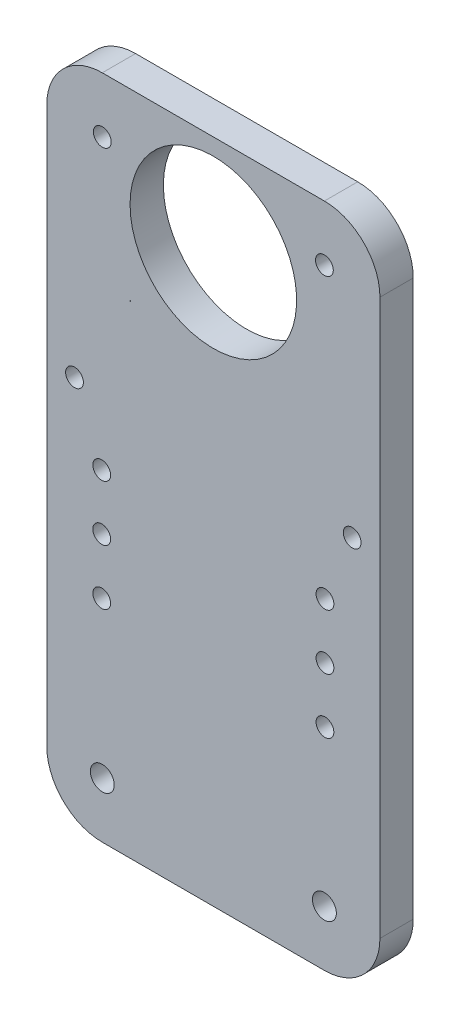
ISO-10303-21;
HEADER;
FILE_DESCRIPTION(('STEP AP214'),'2;1');
FILE_NAME('part.step','',(''),(''),'','','');
FILE_SCHEMA(('AUTOMOTIVE_DESIGN { 1 0 10303 214 1 1 1 1 }'));
ENDSEC;
DATA;
#1=APPLICATION_CONTEXT('core data for automotive mechanical design processes');
#2=APPLICATION_PROTOCOL_DEFINITION('international standard','automotive_design',2000,#1);
#3=PRODUCT_CONTEXT('',#1,'mechanical');
#4=PRODUCT('Part','Part','',(#3));
#5=PRODUCT_RELATED_PRODUCT_CATEGORY('part','',(#4));
#6=PRODUCT_DEFINITION_FORMATION('','',#4);
#7=PRODUCT_DEFINITION_CONTEXT('part definition',#1,'design');
#8=PRODUCT_DEFINITION('design','',#6,#7);
#9=PRODUCT_DEFINITION_SHAPE('','',#8);
#10=(LENGTH_UNIT() NAMED_UNIT(*) SI_UNIT(.MILLI.,.METRE.));
#11=(NAMED_UNIT(*) PLANE_ANGLE_UNIT() SI_UNIT($,.RADIAN.));
#12=(NAMED_UNIT(*) SI_UNIT($,.STERADIAN.) SOLID_ANGLE_UNIT());
#13=UNCERTAINTY_MEASURE_WITH_UNIT(LENGTH_MEASURE(1.E-05),#10,'distance_accuracy_value','');
#14=(GEOMETRIC_REPRESENTATION_CONTEXT(3) GLOBAL_UNCERTAINTY_ASSIGNED_CONTEXT((#13)) GLOBAL_UNIT_ASSIGNED_CONTEXT((#10,
#11,#12)) REPRESENTATION_CONTEXT('',''));
#15=CARTESIAN_POINT('',(0.,0.,0.));
#16=DIRECTION('',(0.,0.,1.));
#17=DIRECTION('',(1.,0.,0.));
#18=AXIS2_PLACEMENT_3D('',#15,#16,#17);
#19=CARTESIAN_POINT('',(0.,0.,6.));
#20=DIRECTION('',(0.,0.,1.));
#21=DIRECTION('',(1.,0.,0.));
#22=AXIS2_PLACEMENT_3D('',#19,#20,#21);
#23=PLANE('',#22);
#24=CARTESIAN_POINT('',(0.,42.,6.));
#25=DIRECTION('',(0.,0.,-1.));
#26=DIRECTION('',(-1.,0.,0.));
#27=AXIS2_PLACEMENT_3D('',#24,#25,#26);
#28=CIRCLE('',#27,15.);
#29=CARTESIAN_POINT('',(-15.,42.,6.));
#30=VERTEX_POINT('',#29);
#31=EDGE_CURVE('E311',#30,#30,#28,.T.);
#32=ORIENTED_EDGE('',*,*,#31,.T.);
#33=EDGE_LOOP('',(#32));
#34=FACE_BOUND('',#33,.T.);
#35=CARTESIAN_POINT('',(-13.4233937586588,27.25,6.));
#36=DIRECTION('',(0.,0.,1.));
#37=DIRECTION('',(1.,0.,0.));
#38=AXIS2_PLACEMENT_3D('',#35,#36,#37);
#39=CIRCLE('',#38,1.6);
#40=CARTESIAN_POINT('',(-14.9934841610112,27.5579222766232,6.));
#41=VERTEX_POINT('',#40);
#42=CARTESIAN_POINT('',(-14.9494100550532,26.7690901715096,6.));
#43=VERTEX_POINT('',#42);
#44=EDGE_CURVE('E152',#41,#43,#39,.T.);
#45=ORIENTED_EDGE('',*,*,#44,.F.);
#46=CARTESIAN_POINT('',(0.,28.,6.));
#47=DIRECTION('',(0.,0.,-1.));
#48=DIRECTION('',(-1.,0.,0.));
#49=AXIS2_PLACEMENT_3D('',#46,#47,#48);
#50=CIRCLE('',#49,15.);
#51=EDGE_CURVE('E317',#41,#43,#50,.F.);
#52=ORIENTED_EDGE('',*,*,#51,.T.);
#53=EDGE_LOOP('',(#45,#52));
#54=FACE_BOUND('',#53,.T.);
#55=CARTESIAN_POINT('',(13.4233937586588,27.25,6.));
#56=DIRECTION('',(0.,0.,1.));
#57=DIRECTION('',(1.,0.,0.));
#58=AXIS2_PLACEMENT_3D('',#55,#56,#57);
#59=CIRCLE('',#58,1.6);
#60=CARTESIAN_POINT('',(14.9494100550532,26.7690901715095,6.));
#61=VERTEX_POINT('',#60);
#62=CARTESIAN_POINT('',(14.9934841610112,27.5579222766234,6.));
#63=VERTEX_POINT('',#62);
#64=EDGE_CURVE('E246',#61,#63,#59,.T.);
#65=ORIENTED_EDGE('',*,*,#64,.F.);
#66=EDGE_CURVE('E313',#61,#63,#50,.F.);
#67=ORIENTED_EDGE('',*,*,#66,.T.);
#68=EDGE_LOOP('',(#65,#67));
#69=FACE_BOUND('',#68,.T.);
#70=CARTESIAN_POINT('',(-20.0000000000032,50.0000000000069,6.));
#71=DIRECTION('',(0.,0.,1.));
#72=DIRECTION('',(1.,0.,0.));
#73=AXIS2_PLACEMENT_3D('',#70,#71,#72);
#74=CIRCLE('',#73,1.59999999999506);
#75=CARTESIAN_POINT('',(-18.4000000000081,50.0000000000069,6.));
#76=VERTEX_POINT('',#75);
#77=EDGE_CURVE('E257',#76,#76,#74,.T.);
#78=ORIENTED_EDGE('',*,*,#77,.F.);
#79=EDGE_LOOP('',(#78));
#80=FACE_BOUND('',#79,.T.);
#81=CARTESIAN_POINT('',(-25.0000000000033,10.0000000000067,6.));
#82=DIRECTION('',(0.,0.,1.));
#83=DIRECTION('',(1.,0.,0.));
#84=AXIS2_PLACEMENT_3D('',#81,#82,#83);
#85=CIRCLE('',#84,1.59999999999507);
#86=CARTESIAN_POINT('',(-23.4000000000082,10.0000000000067,6.));
#87=VERTEX_POINT('',#86);
#88=EDGE_CURVE('E285',#87,#87,#85,.T.);
#89=ORIENTED_EDGE('',*,*,#88,.F.);
#90=EDGE_LOOP('',(#89));
#91=FACE_BOUND('',#90,.T.);
#92=CARTESIAN_POINT('',(24.9999999999967,10.0000000000064,6.));
#93=DIRECTION('',(0.,0.,1.));
#94=DIRECTION('',(1.,0.,0.));
#95=AXIS2_PLACEMENT_3D('',#92,#93,#94);
#96=CIRCLE('',#95,1.59999999999507);
#97=CARTESIAN_POINT('',(26.5999999999918,10.0000000000064,6.));
#98=VERTEX_POINT('',#97);
#99=EDGE_CURVE('E288',#98,#98,#96,.T.);
#100=ORIENTED_EDGE('',*,*,#99,.F.);
#101=EDGE_LOOP('',(#100));
#102=FACE_BOUND('',#101,.T.);
#103=CARTESIAN_POINT('',(19.9999999999969,50.0000000000067,6.));
#104=DIRECTION('',(0.,0.,1.));
#105=DIRECTION('',(1.,0.,0.));
#106=AXIS2_PLACEMENT_3D('',#103,#104,#105);
#107=CIRCLE('',#106,1.59999999999506);
#108=CARTESIAN_POINT('',(21.599999999992,50.0000000000067,6.));
#109=VERTEX_POINT('',#108);
#110=EDGE_CURVE('E291',#109,#109,#107,.T.);
#111=ORIENTED_EDGE('',*,*,#110,.F.);
#112=EDGE_LOOP('',(#111));
#113=FACE_BOUND('',#112,.T.);
#114=CARTESIAN_POINT('',(20.1000000000003,-11.9999999999998,6.));
#115=DIRECTION('',(0.,0.,1.));
#116=DIRECTION('',(1.,0.,0.));
#117=AXIS2_PLACEMENT_3D('',#114,#115,#116);
#118=CIRCLE('',#117,1.6);
#119=CARTESIAN_POINT('',(21.7000000000003,-11.9999999999998,6.));
#120=VERTEX_POINT('',#119);
#121=EDGE_CURVE('E275',#120,#120,#118,.F.);
#122=ORIENTED_EDGE('',*,*,#121,.T.);
#123=EDGE_LOOP('',(#122));
#124=FACE_BOUND('',#123,.T.);
#125=CARTESIAN_POINT('',(20.1000000000002,-1.99999999999975,6.));
#126=DIRECTION('',(0.,0.,1.));
#127=DIRECTION('',(1.,0.,0.));
#128=AXIS2_PLACEMENT_3D('',#125,#126,#127);
#129=CIRCLE('',#128,1.6);
#130=CARTESIAN_POINT('',(21.7000000000002,-1.99999999999975,6.));
#131=VERTEX_POINT('',#130);
#132=EDGE_CURVE('E251',#131,#131,#129,.F.);
#133=ORIENTED_EDGE('',*,*,#132,.T.);
#134=EDGE_LOOP('',(#133));
#135=FACE_BOUND('',#134,.T.);
#136=CARTESIAN_POINT('',(20.1000000000004,-21.9999999999998,6.));
#137=DIRECTION('',(0.,0.,1.));
#138=DIRECTION('',(1.,0.,0.));
#139=AXIS2_PLACEMENT_3D('',#136,#137,#138);
#140=CIRCLE('',#139,1.6);
#141=CARTESIAN_POINT('',(21.7000000000004,-21.9999999999998,6.));
#142=VERTEX_POINT('',#141);
#143=EDGE_CURVE('E162',#142,#142,#140,.F.);
#144=ORIENTED_EDGE('',*,*,#143,.T.);
#145=EDGE_LOOP('',(#144));
#146=FACE_BOUND('',#145,.T.);
#147=CARTESIAN_POINT('',(20.,-50.,6.));
#148=DIRECTION('',(0.,0.,1.));
#149=DIRECTION('',(1.,0.,0.));
#150=AXIS2_PLACEMENT_3D('',#147,#148,#149);
#151=CIRCLE('',#150,2.15);
#152=CARTESIAN_POINT('',(22.15,-50.,6.));
#153=VERTEX_POINT('',#152);
#154=EDGE_CURVE('E243',#153,#153,#151,.T.);
#155=ORIENTED_EDGE('',*,*,#154,.F.);
#156=EDGE_LOOP('',(#155));
#157=FACE_BOUND('',#156,.T.);
#158=DIRECTION('',(1.,0.,0.));
#159=VECTOR('',#158,1.);
#160=CARTESIAN_POINT('',(0.,-60.,6.));
#161=LINE('',#160,#159);
#162=CARTESIAN_POINT('',(-20.,-60.,6.));
#163=VERTEX_POINT('',#162);
#164=CARTESIAN_POINT('',(20.,-60.,6.));
#165=VERTEX_POINT('',#164);
#166=EDGE_CURVE('E235',#163,#165,#161,.T.);
#167=ORIENTED_EDGE('',*,*,#166,.T.);
#168=CARTESIAN_POINT('',(20.,-50.,6.));
#169=DIRECTION('',(0.,0.,1.));
#170=DIRECTION('',(1.,0.,0.));
#171=AXIS2_PLACEMENT_3D('',#168,#169,#170);
#172=CIRCLE('',#171,10.);
#173=CARTESIAN_POINT('',(30.,-50.,6.));
#174=VERTEX_POINT('',#173);
#175=EDGE_CURVE('E208',#165,#174,#172,.T.);
#176=ORIENTED_EDGE('',*,*,#175,.T.);
#177=DIRECTION('',(0.,1.,0.));
#178=VECTOR('',#177,1.);
#179=CARTESIAN_POINT('',(30.,0.,6.));
#180=LINE('',#179,#178);
#181=CARTESIAN_POINT('',(30.,50.,6.));
#182=VERTEX_POINT('',#181);
#183=EDGE_CURVE('E238',#174,#182,#180,.T.);
#184=ORIENTED_EDGE('',*,*,#183,.T.);
#185=CARTESIAN_POINT('',(20.,50.,6.));
#186=DIRECTION('',(0.,0.,1.));
#187=DIRECTION('',(1.,0.,0.));
#188=AXIS2_PLACEMENT_3D('',#185,#186,#187);
#189=CIRCLE('',#188,10.);
#190=CARTESIAN_POINT('',(20.,60.,6.));
#191=VERTEX_POINT('',#190);
#192=EDGE_CURVE('E204',#182,#191,#189,.T.);
#193=ORIENTED_EDGE('',*,*,#192,.T.);
#194=DIRECTION('',(1.,0.,0.));
#195=VECTOR('',#194,1.);
#196=CARTESIAN_POINT('',(0.,60.,6.));
#197=LINE('',#196,#195);
#198=CARTESIAN_POINT('',(-20.,60.,6.));
#199=VERTEX_POINT('',#198);
#200=EDGE_CURVE('E224',#199,#191,#197,.T.);
#201=ORIENTED_EDGE('',*,*,#200,.F.);
#202=CARTESIAN_POINT('',(-20.,50.,6.));
#203=DIRECTION('',(0.,0.,1.));
#204=DIRECTION('',(1.,0.,0.));
#205=AXIS2_PLACEMENT_3D('',#202,#203,#204);
#206=CIRCLE('',#205,10.);
#207=CARTESIAN_POINT('',(-30.,50.,6.));
#208=VERTEX_POINT('',#207);
#209=EDGE_CURVE('E62',#199,#208,#206,.T.);
#210=ORIENTED_EDGE('',*,*,#209,.T.);
#211=DIRECTION('',(0.,1.,0.));
#212=VECTOR('',#211,1.);
#213=CARTESIAN_POINT('',(-30.,0.,6.));
#214=LINE('',#213,#212);
#215=CARTESIAN_POINT('',(-30.,-50.,6.));
#216=VERTEX_POINT('',#215);
#217=EDGE_CURVE('E233',#216,#208,#214,.T.);
#218=ORIENTED_EDGE('',*,*,#217,.F.);
#219=CARTESIAN_POINT('',(-20.,-50.,6.));
#220=DIRECTION('',(0.,0.,1.));
#221=DIRECTION('',(1.,0.,0.));
#222=AXIS2_PLACEMENT_3D('',#219,#220,#221);
#223=CIRCLE('',#222,10.);
#224=EDGE_CURVE('E206',#216,#163,#223,.T.);
#225=ORIENTED_EDGE('',*,*,#224,.T.);
#226=EDGE_LOOP('',(#167,#176,#184,#193,#201,#210,#218,#225));
#227=FACE_BOUND('',#226,.T.);
#228=CARTESIAN_POINT('',(-20.,-50.,6.));
#229=DIRECTION('',(0.,0.,1.));
#230=DIRECTION('',(1.,0.,0.));
#231=AXIS2_PLACEMENT_3D('',#228,#229,#230);
#232=CIRCLE('',#231,2.15);
#233=CARTESIAN_POINT('',(-17.85,-50.,6.));
#234=VERTEX_POINT('',#233);
#235=EDGE_CURVE('E165',#234,#234,#232,.F.);
#236=ORIENTED_EDGE('',*,*,#235,.T.);
#237=EDGE_LOOP('',(#236));
#238=FACE_BOUND('',#237,.T.);
#239=CARTESIAN_POINT('',(-20.1,-1.99999999999997,6.));
#240=DIRECTION('',(0.,0.,1.));
#241=DIRECTION('',(1.,0.,0.));
#242=AXIS2_PLACEMENT_3D('',#239,#240,#241);
#243=CIRCLE('',#242,1.6);
#244=CARTESIAN_POINT('',(-18.5,-1.99999999999997,6.));
#245=VERTEX_POINT('',#244);
#246=EDGE_CURVE('E269',#245,#245,#243,.T.);
#247=ORIENTED_EDGE('',*,*,#246,.F.);
#248=EDGE_LOOP('',(#247));
#249=FACE_BOUND('',#248,.T.);
#250=CARTESIAN_POINT('',(-20.1,-12.,6.));
#251=DIRECTION('',(0.,0.,1.));
#252=DIRECTION('',(1.,0.,0.));
#253=AXIS2_PLACEMENT_3D('',#250,#251,#252);
#254=CIRCLE('',#253,1.6);
#255=CARTESIAN_POINT('',(-18.5,-12.,6.));
#256=VERTEX_POINT('',#255);
#257=EDGE_CURVE('E263',#256,#256,#254,.T.);
#258=ORIENTED_EDGE('',*,*,#257,.F.);
#259=EDGE_LOOP('',(#258));
#260=FACE_BOUND('',#259,.T.);
#261=CARTESIAN_POINT('',(-20.0999999999999,-22.,6.));
#262=DIRECTION('',(0.,0.,1.));
#263=DIRECTION('',(1.,0.,0.));
#264=AXIS2_PLACEMENT_3D('',#261,#262,#263);
#265=CIRCLE('',#264,1.6);
#266=CARTESIAN_POINT('',(-18.4999999999999,-22.,6.));
#267=VERTEX_POINT('',#266);
#268=EDGE_CURVE('E256',#267,#267,#265,.T.);
#269=ORIENTED_EDGE('',*,*,#268,.F.);
#270=EDGE_LOOP('',(#269));
#271=FACE_BOUND('',#270,.T.);
#272=ADVANCED_FACE('F47',(#34,#54,#69,#80,#91,#102,#113,#124,#135,#146,#157,#227,#238,#249,#260,
#271),#23,.T.);
#273=CARTESIAN_POINT('',(0.,0.,0.));
#274=DIRECTION('',(0.,0.,1.));
#275=DIRECTION('',(1.,0.,0.));
#276=AXIS2_PLACEMENT_3D('',#273,#274,#275);
#277=PLANE('',#276);
#278=CARTESIAN_POINT('',(0.,28.,0.));
#279=DIRECTION('',(0.,0.,-1.));
#280=DIRECTION('',(-1.,0.,0.));
#281=AXIS2_PLACEMENT_3D('',#278,#279,#280);
#282=CIRCLE('',#281,15.);
#283=CARTESIAN_POINT('',(-14.9934841610112,27.5579222766232,0.));
#284=VERTEX_POINT('',#283);
#285=CARTESIAN_POINT('',(-14.9494100550532,26.7690901715096,0.));
#286=VERTEX_POINT('',#285);
#287=EDGE_CURVE('E136',#284,#286,#282,.F.);
#288=ORIENTED_EDGE('',*,*,#287,.F.);
#289=CARTESIAN_POINT('',(-13.4233937586588,27.25,0.));
#290=DIRECTION('',(0.,0.,1.));
#291=DIRECTION('',(1.,0.,0.));
#292=AXIS2_PLACEMENT_3D('',#289,#290,#291);
#293=CIRCLE('',#292,1.6);
#294=EDGE_CURVE('E150',#284,#286,#293,.T.);
#295=ORIENTED_EDGE('',*,*,#294,.T.);
#296=EDGE_LOOP('',(#288,#295));
#297=FACE_BOUND('',#296,.T.);
#298=CARTESIAN_POINT('',(14.9494100550532,26.7690901715095,0.));
#299=VERTEX_POINT('',#298);
#300=CARTESIAN_POINT('',(14.9934841610112,27.5579222766233,0.));
#301=VERTEX_POINT('',#300);
#302=EDGE_CURVE('E145',#299,#301,#282,.F.);
#303=ORIENTED_EDGE('',*,*,#302,.F.);
#304=CARTESIAN_POINT('',(13.4233937586588,27.25,0.));
#305=DIRECTION('',(0.,0.,1.));
#306=DIRECTION('',(1.,0.,0.));
#307=AXIS2_PLACEMENT_3D('',#304,#305,#306);
#308=CIRCLE('',#307,1.6);
#309=EDGE_CURVE('E155',#299,#301,#308,.T.);
#310=ORIENTED_EDGE('',*,*,#309,.T.);
#311=EDGE_LOOP('',(#303,#310));
#312=FACE_BOUND('',#311,.T.);
#313=CARTESIAN_POINT('',(-20.0000000000032,50.0000000000069,0.));
#314=DIRECTION('',(0.,0.,-1.));
#315=DIRECTION('',(-1.,0.,0.));
#316=AXIS2_PLACEMENT_3D('',#313,#314,#315);
#317=CIRCLE('',#316,1.59999999999506);
#318=CARTESIAN_POINT('',(-21.5999999999982,50.0000000000069,0.));
#319=VERTEX_POINT('',#318);
#320=EDGE_CURVE('E298',#319,#319,#317,.T.);
#321=ORIENTED_EDGE('',*,*,#320,.F.);
#322=EDGE_LOOP('',(#321));
#323=FACE_BOUND('',#322,.T.);
#324=CARTESIAN_POINT('',(-25.0000000000033,10.0000000000067,0.));
#325=DIRECTION('',(0.,0.,-1.));
#326=DIRECTION('',(-1.,0.,0.));
#327=AXIS2_PLACEMENT_3D('',#324,#325,#326);
#328=CIRCLE('',#327,1.59999999999507);
#329=CARTESIAN_POINT('',(-26.5999999999983,10.0000000000067,0.));
#330=VERTEX_POINT('',#329);
#331=EDGE_CURVE('E301',#330,#330,#328,.T.);
#332=ORIENTED_EDGE('',*,*,#331,.F.);
#333=EDGE_LOOP('',(#332));
#334=FACE_BOUND('',#333,.T.);
#335=CARTESIAN_POINT('',(24.9999999999967,10.0000000000064,0.));
#336=DIRECTION('',(0.,0.,-1.));
#337=DIRECTION('',(-1.,0.,0.));
#338=AXIS2_PLACEMENT_3D('',#335,#336,#337);
#339=CIRCLE('',#338,1.59999999999507);
#340=CARTESIAN_POINT('',(23.4000000000017,10.0000000000064,0.));
#341=VERTEX_POINT('',#340);
#342=EDGE_CURVE('E297',#341,#341,#339,.T.);
#343=ORIENTED_EDGE('',*,*,#342,.F.);
#344=EDGE_LOOP('',(#343));
#345=FACE_BOUND('',#344,.T.);
#346=CARTESIAN_POINT('',(19.9999999999969,50.0000000000067,0.));
#347=DIRECTION('',(0.,0.,-1.));
#348=DIRECTION('',(-1.,0.,0.));
#349=AXIS2_PLACEMENT_3D('',#346,#347,#348);
#350=CIRCLE('',#349,1.59999999999506);
#351=CARTESIAN_POINT('',(18.4000000000019,50.0000000000067,0.));
#352=VERTEX_POINT('',#351);
#353=EDGE_CURVE('E294',#352,#352,#350,.T.);
#354=ORIENTED_EDGE('',*,*,#353,.F.);
#355=EDGE_LOOP('',(#354));
#356=FACE_BOUND('',#355,.T.);
#357=CARTESIAN_POINT('',(-20.1,-12.,0.));
#358=DIRECTION('',(0.,0.,1.));
#359=DIRECTION('',(1.,0.,0.));
#360=AXIS2_PLACEMENT_3D('',#357,#358,#359);
#361=CIRCLE('',#360,1.6);
#362=CARTESIAN_POINT('',(-18.5,-12.,0.));
#363=VERTEX_POINT('',#362);
#364=EDGE_CURVE('E260',#363,#363,#361,.T.);
#365=ORIENTED_EDGE('',*,*,#364,.T.);
#366=EDGE_LOOP('',(#365));
#367=FACE_BOUND('',#366,.T.);
#368=CARTESIAN_POINT('',(-20.,-50.,0.));
#369=DIRECTION('',(0.,0.,1.));
#370=DIRECTION('',(1.,0.,0.));
#371=AXIS2_PLACEMENT_3D('',#368,#369,#370);
#372=CIRCLE('',#371,2.15);
#373=CARTESIAN_POINT('',(-17.85,-50.,0.));
#374=VERTEX_POINT('',#373);
#375=EDGE_CURVE('E182',#374,#374,#372,.F.);
#376=ORIENTED_EDGE('',*,*,#375,.F.);
#377=EDGE_LOOP('',(#376));
#378=FACE_BOUND('',#377,.T.);
#379=DIRECTION('',(0.,1.,0.));
#380=VECTOR('',#379,1.);
#381=CARTESIAN_POINT('',(30.,0.,0.));
#382=LINE('',#381,#380);
#383=CARTESIAN_POINT('',(30.,-50.,0.));
#384=VERTEX_POINT('',#383);
#385=CARTESIAN_POINT('',(30.,50.,0.));
#386=VERTEX_POINT('',#385);
#387=EDGE_CURVE('E170',#384,#386,#382,.T.);
#388=ORIENTED_EDGE('',*,*,#387,.F.);
#389=CARTESIAN_POINT('',(20.,-50.,0.));
#390=DIRECTION('',(0.,0.,1.));
#391=DIRECTION('',(1.,0.,0.));
#392=AXIS2_PLACEMENT_3D('',#389,#390,#391);
#393=CIRCLE('',#392,10.);
#394=CARTESIAN_POINT('',(20.,-60.,0.));
#395=VERTEX_POINT('',#394);
#396=EDGE_CURVE('E196',#384,#395,#393,.F.);
#397=ORIENTED_EDGE('',*,*,#396,.T.);
#398=DIRECTION('',(1.,0.,0.));
#399=VECTOR('',#398,1.);
#400=CARTESIAN_POINT('',(0.,-60.,0.));
#401=LINE('',#400,#399);
#402=CARTESIAN_POINT('',(-20.,-60.,0.));
#403=VERTEX_POINT('',#402);
#404=EDGE_CURVE('E179',#403,#395,#401,.T.);
#405=ORIENTED_EDGE('',*,*,#404,.F.);
#406=CARTESIAN_POINT('',(-20.,-50.,0.));
#407=DIRECTION('',(0.,0.,1.));
#408=DIRECTION('',(1.,0.,0.));
#409=AXIS2_PLACEMENT_3D('',#406,#407,#408);
#410=CIRCLE('',#409,10.);
#411=CARTESIAN_POINT('',(-30.,-50.,0.));
#412=VERTEX_POINT('',#411);
#413=EDGE_CURVE('E194',#403,#412,#410,.F.);
#414=ORIENTED_EDGE('',*,*,#413,.T.);
#415=DIRECTION('',(0.,1.,0.));
#416=VECTOR('',#415,1.);
#417=CARTESIAN_POINT('',(-30.,0.,0.));
#418=LINE('',#417,#416);
#419=CARTESIAN_POINT('',(-30.,50.,0.));
#420=VERTEX_POINT('',#419);
#421=EDGE_CURVE('E176',#412,#420,#418,.T.);
#422=ORIENTED_EDGE('',*,*,#421,.T.);
#423=CARTESIAN_POINT('',(-20.,50.,0.));
#424=DIRECTION('',(0.,0.,1.));
#425=DIRECTION('',(1.,0.,0.));
#426=AXIS2_PLACEMENT_3D('',#423,#424,#425);
#427=CIRCLE('',#426,10.);
#428=CARTESIAN_POINT('',(-20.,60.,0.));
#429=VERTEX_POINT('',#428);
#430=EDGE_CURVE('E190',#420,#429,#427,.F.);
#431=ORIENTED_EDGE('',*,*,#430,.T.);
#432=DIRECTION('',(1.,0.,0.));
#433=VECTOR('',#432,1.);
#434=CARTESIAN_POINT('',(0.,60.,0.));
#435=LINE('',#434,#433);
#436=CARTESIAN_POINT('',(20.,60.,0.));
#437=VERTEX_POINT('',#436);
#438=EDGE_CURVE('E173',#429,#437,#435,.T.);
#439=ORIENTED_EDGE('',*,*,#438,.T.);
#440=CARTESIAN_POINT('',(20.,50.,0.));
#441=DIRECTION('',(0.,0.,1.));
#442=DIRECTION('',(1.,0.,0.));
#443=AXIS2_PLACEMENT_3D('',#440,#441,#442);
#444=CIRCLE('',#443,10.);
#445=EDGE_CURVE('E192',#437,#386,#444,.F.);
#446=ORIENTED_EDGE('',*,*,#445,.T.);
#447=EDGE_LOOP('',(#388,#397,#405,#414,#422,#431,#439,#446));
#448=FACE_BOUND('',#447,.T.);
#449=CARTESIAN_POINT('',(20.,-50.,0.));
#450=DIRECTION('',(0.,0.,1.));
#451=DIRECTION('',(1.,0.,0.));
#452=AXIS2_PLACEMENT_3D('',#449,#450,#451);
#453=CIRCLE('',#452,2.15);
#454=CARTESIAN_POINT('',(22.15,-50.,0.));
#455=VERTEX_POINT('',#454);
#456=EDGE_CURVE('E159',#455,#455,#453,.T.);
#457=ORIENTED_EDGE('',*,*,#456,.T.);
#458=EDGE_LOOP('',(#457));
#459=FACE_BOUND('',#458,.T.);
#460=CARTESIAN_POINT('',(0.,42.,0.));
#461=DIRECTION('',(0.,0.,-1.));
#462=DIRECTION('',(-1.,0.,0.));
#463=AXIS2_PLACEMENT_3D('',#460,#461,#462);
#464=CIRCLE('',#463,15.);
#465=CARTESIAN_POINT('',(-15.,42.,0.));
#466=VERTEX_POINT('',#465);
#467=EDGE_CURVE('E144',#466,#466,#464,.T.);
#468=ORIENTED_EDGE('',*,*,#467,.F.);
#469=EDGE_LOOP('',(#468));
#470=FACE_BOUND('',#469,.T.);
#471=CARTESIAN_POINT('',(20.1000000000004,-21.9999999999998,0.));
#472=DIRECTION('',(0.,0.,1.));
#473=DIRECTION('',(1.,0.,0.));
#474=AXIS2_PLACEMENT_3D('',#471,#472,#473);
#475=CIRCLE('',#474,1.6);
#476=CARTESIAN_POINT('',(21.7000000000004,-21.9999999999998,0.));
#477=VERTEX_POINT('',#476);
#478=EDGE_CURVE('E156',#477,#477,#475,.F.);
#479=ORIENTED_EDGE('',*,*,#478,.F.);
#480=EDGE_LOOP('',(#479));
#481=FACE_BOUND('',#480,.T.);
#482=CARTESIAN_POINT('',(20.1000000000002,-1.99999999999975,0.));
#483=DIRECTION('',(0.,0.,1.));
#484=DIRECTION('',(1.,0.,0.));
#485=AXIS2_PLACEMENT_3D('',#482,#483,#484);
#486=CIRCLE('',#485,1.6);
#487=CARTESIAN_POINT('',(21.7000000000002,-1.99999999999975,0.));
#488=VERTEX_POINT('',#487);
#489=EDGE_CURVE('E278',#488,#488,#486,.F.);
#490=ORIENTED_EDGE('',*,*,#489,.F.);
#491=EDGE_LOOP('',(#490));
#492=FACE_BOUND('',#491,.T.);
#493=CARTESIAN_POINT('',(20.1000000000003,-11.9999999999998,0.));
#494=DIRECTION('',(0.,0.,1.));
#495=DIRECTION('',(1.,0.,0.));
#496=AXIS2_PLACEMENT_3D('',#493,#494,#495);
#497=CIRCLE('',#496,1.6);
#498=CARTESIAN_POINT('',(21.7000000000003,-11.9999999999998,0.));
#499=VERTEX_POINT('',#498);
#500=EDGE_CURVE('E272',#499,#499,#497,.F.);
#501=ORIENTED_EDGE('',*,*,#500,.F.);
#502=EDGE_LOOP('',(#501));
#503=FACE_BOUND('',#502,.T.);
#504=CARTESIAN_POINT('',(-20.1,-1.99999999999997,0.));
#505=DIRECTION('',(0.,0.,1.));
#506=DIRECTION('',(1.,0.,0.));
#507=AXIS2_PLACEMENT_3D('',#504,#505,#506);
#508=CIRCLE('',#507,1.6);
#509=CARTESIAN_POINT('',(-18.5,-1.99999999999997,0.));
#510=VERTEX_POINT('',#509);
#511=EDGE_CURVE('E266',#510,#510,#508,.T.);
#512=ORIENTED_EDGE('',*,*,#511,.T.);
#513=EDGE_LOOP('',(#512));
#514=FACE_BOUND('',#513,.T.);
#515=CARTESIAN_POINT('',(-20.0999999999999,-22.,0.));
#516=DIRECTION('',(0.,0.,1.));
#517=DIRECTION('',(1.,0.,0.));
#518=AXIS2_PLACEMENT_3D('',#515,#516,#517);
#519=CIRCLE('',#518,1.6);
#520=CARTESIAN_POINT('',(-18.4999999999999,-22.,0.));
#521=VERTEX_POINT('',#520);
#522=EDGE_CURVE('E253',#521,#521,#519,.T.);
#523=ORIENTED_EDGE('',*,*,#522,.T.);
#524=EDGE_LOOP('',(#523));
#525=FACE_BOUND('',#524,.T.);
#526=ADVANCED_FACE('F153',(#297,#312,#323,#334,#345,#356,#367,#378,#448,#459,#470,#481,#492,
#503,#514,#525),#277,.F.);
#527=CARTESIAN_POINT('',(30.,0.,6.));
#528=DIRECTION('',(-1.,0.,0.));
#529=DIRECTION('',(0.,-1.,0.));
#530=AXIS2_PLACEMENT_3D('',#527,#528,#529);
#531=PLANE('',#530);
#532=ORIENTED_EDGE('',*,*,#183,.F.);
#533=DIRECTION('',(0.,0.,-1.));
#534=VECTOR('',#533,1.);
#535=CARTESIAN_POINT('',(30.,-50.,6.));
#536=LINE('',#535,#534);
#537=EDGE_CURVE('E187',#174,#384,#536,.T.);
#538=ORIENTED_EDGE('',*,*,#537,.T.);
#539=ORIENTED_EDGE('',*,*,#387,.T.);
#540=DIRECTION('',(0.,0.,-1.));
#541=VECTOR('',#540,1.);
#542=CARTESIAN_POINT('',(30.,50.,6.));
#543=LINE('',#542,#541);
#544=EDGE_CURVE('E185',#386,#182,#543,.F.);
#545=ORIENTED_EDGE('',*,*,#544,.T.);
#546=EDGE_LOOP('',(#532,#538,#539,#545));
#547=FACE_BOUND('',#546,.T.);
#548=ADVANCED_FACE('F381',(#547),#531,.F.);
#549=CARTESIAN_POINT('',(0.,60.,6.));
#550=DIRECTION('',(0.,1.,0.));
#551=DIRECTION('',(-1.,0.,0.));
#552=AXIS2_PLACEMENT_3D('',#549,#550,#551);
#553=PLANE('',#552);
#554=ORIENTED_EDGE('',*,*,#200,.T.);
#555=DIRECTION('',(0.,0.,-1.));
#556=VECTOR('',#555,1.);
#557=CARTESIAN_POINT('',(20.,60.,0.));
#558=LINE('',#557,#556);
#559=EDGE_CURVE('E216',#191,#437,#558,.T.);
#560=ORIENTED_EDGE('',*,*,#559,.T.);
#561=ORIENTED_EDGE('',*,*,#438,.F.);
#562=DIRECTION('',(0.,0.,-1.));
#563=VECTOR('',#562,1.);
#564=CARTESIAN_POINT('',(-20.,60.,6.));
#565=LINE('',#564,#563);
#566=EDGE_CURVE('E214',#429,#199,#565,.F.);
#567=ORIENTED_EDGE('',*,*,#566,.T.);
#568=EDGE_LOOP('',(#554,#560,#561,#567));
#569=FACE_BOUND('',#568,.T.);
#570=ADVANCED_FACE('F222',(#569),#553,.T.);
#571=CARTESIAN_POINT('',(-30.,0.,6.));
#572=DIRECTION('',(-1.,0.,0.));
#573=DIRECTION('',(0.,-1.,0.));
#574=AXIS2_PLACEMENT_3D('',#571,#572,#573);
#575=PLANE('',#574);
#576=ORIENTED_EDGE('',*,*,#421,.F.);
#577=DIRECTION('',(0.,0.,-1.));
#578=VECTOR('',#577,1.);
#579=CARTESIAN_POINT('',(-30.,-50.,6.));
#580=LINE('',#579,#578);
#581=EDGE_CURVE('E69',#412,#216,#580,.F.);
#582=ORIENTED_EDGE('',*,*,#581,.T.);
#583=ORIENTED_EDGE('',*,*,#217,.T.);
#584=DIRECTION('',(0.,0.,-1.));
#585=VECTOR('',#584,1.);
#586=CARTESIAN_POINT('',(-30.,50.,6.));
#587=LINE('',#586,#585);
#588=EDGE_CURVE('E210',#208,#420,#587,.T.);
#589=ORIENTED_EDGE('',*,*,#588,.T.);
#590=EDGE_LOOP('',(#576,#582,#583,#589));
#591=FACE_BOUND('',#590,.T.);
#592=ADVANCED_FACE('F232',(#591),#575,.T.);
#593=CARTESIAN_POINT('',(0.,-60.,6.));
#594=DIRECTION('',(0.,1.,0.));
#595=DIRECTION('',(0.,0.,1.));
#596=AXIS2_PLACEMENT_3D('',#593,#594,#595);
#597=PLANE('',#596);
#598=ORIENTED_EDGE('',*,*,#404,.T.);
#599=DIRECTION('',(0.,0.,-1.));
#600=VECTOR('',#599,1.);
#601=CARTESIAN_POINT('',(20.,-60.,6.));
#602=LINE('',#601,#600);
#603=EDGE_CURVE('E201',#395,#165,#602,.F.);
#604=ORIENTED_EDGE('',*,*,#603,.T.);
#605=ORIENTED_EDGE('',*,*,#166,.F.);
#606=DIRECTION('',(0.,0.,-1.));
#607=VECTOR('',#606,1.);
#608=CARTESIAN_POINT('',(-20.,-60.,0.));
#609=LINE('',#608,#607);
#610=EDGE_CURVE('E198',#163,#403,#609,.T.);
#611=ORIENTED_EDGE('',*,*,#610,.T.);
#612=EDGE_LOOP('',(#598,#604,#605,#611));
#613=FACE_BOUND('',#612,.T.);
#614=ADVANCED_FACE('F385',(#613),#597,.F.);
#615=CARTESIAN_POINT('',(20.,-50.,6.));
#616=DIRECTION('',(0.,0.,-1.));
#617=DIRECTION('',(-1.,0.,0.));
#618=AXIS2_PLACEMENT_3D('',#615,#616,#617);
#619=CYLINDRICAL_SURFACE('',#618,2.15);
#620=ORIENTED_EDGE('',*,*,#154,.T.);
#621=EDGE_LOOP('',(#620));
#622=FACE_BOUND('',#621,.T.);
#623=ORIENTED_EDGE('',*,*,#456,.F.);
#624=EDGE_LOOP('',(#623));
#625=FACE_BOUND('',#624,.T.);
#626=ADVANCED_FACE('F388',(#622,#625),#619,.F.);
#627=CARTESIAN_POINT('',(13.4233937586588,27.25,6.));
#628=DIRECTION('',(0.,0.,-1.));
#629=DIRECTION('',(-1.,0.,0.));
#630=AXIS2_PLACEMENT_3D('',#627,#628,#629);
#631=CYLINDRICAL_SURFACE('',#630,1.6);
#632=DIRECTION('',(0.,0.,1.));
#633=VECTOR('',#632,1.);
#634=CARTESIAN_POINT('',(14.9934841610112,27.5579222766233,1.));
#635=LINE('',#634,#633);
#636=EDGE_CURVE('E302',#301,#63,#635,.T.);
#637=ORIENTED_EDGE('',*,*,#636,.F.);
#638=ORIENTED_EDGE('',*,*,#309,.F.);
#639=DIRECTION('',(0.,0.,1.));
#640=VECTOR('',#639,1.);
#641=CARTESIAN_POINT('',(14.9494100550532,26.7690901715095,1.));
#642=LINE('',#641,#640);
#643=EDGE_CURVE('E308',#61,#299,#642,.F.);
#644=ORIENTED_EDGE('',*,*,#643,.F.);
#645=ORIENTED_EDGE('',*,*,#64,.T.);
#646=EDGE_LOOP('',(#637,#638,#644,#645));
#647=FACE_BOUND('',#646,.T.);
#648=ADVANCED_FACE('F398',(#647),#631,.F.);
#649=CARTESIAN_POINT('',(-13.4233937586588,27.25,6.));
#650=DIRECTION('',(0.,0.,-1.));
#651=DIRECTION('',(-1.,0.,0.));
#652=AXIS2_PLACEMENT_3D('',#649,#650,#651);
#653=CYLINDRICAL_SURFACE('',#652,1.6);
#654=DIRECTION('',(0.,0.,1.));
#655=VECTOR('',#654,1.);
#656=CARTESIAN_POINT('',(-14.9494100550532,26.7690901715096,1.));
#657=LINE('',#656,#655);
#658=EDGE_CURVE('E11',#286,#43,#657,.T.);
#659=ORIENTED_EDGE('',*,*,#658,.F.);
#660=ORIENTED_EDGE('',*,*,#294,.F.);
#661=DIRECTION('',(0.,0.,1.));
#662=VECTOR('',#661,1.);
#663=CARTESIAN_POINT('',(-14.9934841610112,27.5579222766232,1.));
#664=LINE('',#663,#662);
#665=EDGE_CURVE('E55',#41,#284,#664,.F.);
#666=ORIENTED_EDGE('',*,*,#665,.F.);
#667=ORIENTED_EDGE('',*,*,#44,.T.);
#668=EDGE_LOOP('',(#659,#660,#666,#667));
#669=FACE_BOUND('',#668,.T.);
#670=ADVANCED_FACE('F149',(#669),#653,.F.);
#671=CARTESIAN_POINT('',(-20.,-50.,6.));
#672=DIRECTION('',(0.,0.,-1.));
#673=DIRECTION('',(-1.,0.,0.));
#674=AXIS2_PLACEMENT_3D('',#671,#672,#673);
#675=CYLINDRICAL_SURFACE('',#674,2.15);
#676=ORIENTED_EDGE('',*,*,#235,.F.);
#677=EDGE_LOOP('',(#676));
#678=FACE_BOUND('',#677,.T.);
#679=ORIENTED_EDGE('',*,*,#375,.T.);
#680=EDGE_LOOP('',(#679));
#681=FACE_BOUND('',#680,.T.);
#682=ADVANCED_FACE('F376',(#678,#681),#675,.F.);
#683=CARTESIAN_POINT('',(20.1000000000004,-21.9999999999998,0.));
#684=DIRECTION('',(0.,0.,1.));
#685=DIRECTION('',(1.,0.,0.));
#686=AXIS2_PLACEMENT_3D('',#683,#684,#685);
#687=CYLINDRICAL_SURFACE('',#686,1.6);
#688=ORIENTED_EDGE('',*,*,#478,.T.);
#689=EDGE_LOOP('',(#688));
#690=FACE_BOUND('',#689,.T.);
#691=ORIENTED_EDGE('',*,*,#143,.F.);
#692=EDGE_LOOP('',(#691));
#693=FACE_BOUND('',#692,.T.);
#694=ADVANCED_FACE('F373',(#690,#693),#687,.F.);
#695=CARTESIAN_POINT('',(20.1000000000002,-1.99999999999975,0.));
#696=DIRECTION('',(0.,0.,1.));
#697=DIRECTION('',(1.,0.,0.));
#698=AXIS2_PLACEMENT_3D('',#695,#696,#697);
#699=CYLINDRICAL_SURFACE('',#698,1.6);
#700=ORIENTED_EDGE('',*,*,#489,.T.);
#701=EDGE_LOOP('',(#700));
#702=FACE_BOUND('',#701,.T.);
#703=ORIENTED_EDGE('',*,*,#132,.F.);
#704=EDGE_LOOP('',(#703));
#705=FACE_BOUND('',#704,.T.);
#706=ADVANCED_FACE('F375',(#702,#705),#699,.F.);
#707=CARTESIAN_POINT('',(20.1000000000003,-11.9999999999998,0.));
#708=DIRECTION('',(0.,0.,1.));
#709=DIRECTION('',(1.,0.,0.));
#710=AXIS2_PLACEMENT_3D('',#707,#708,#709);
#711=CYLINDRICAL_SURFACE('',#710,1.6);
#712=ORIENTED_EDGE('',*,*,#500,.T.);
#713=EDGE_LOOP('',(#712));
#714=FACE_BOUND('',#713,.T.);
#715=ORIENTED_EDGE('',*,*,#121,.F.);
#716=EDGE_LOOP('',(#715));
#717=FACE_BOUND('',#716,.T.);
#718=ADVANCED_FACE('F438',(#714,#717),#711,.F.);
#719=CARTESIAN_POINT('',(-20.1,-1.99999999999997,0.));
#720=DIRECTION('',(0.,0.,1.));
#721=DIRECTION('',(1.,0.,0.));
#722=AXIS2_PLACEMENT_3D('',#719,#720,#721);
#723=CYLINDRICAL_SURFACE('',#722,1.6);
#724=ORIENTED_EDGE('',*,*,#511,.F.);
#725=EDGE_LOOP('',(#724));
#726=FACE_BOUND('',#725,.T.);
#727=ORIENTED_EDGE('',*,*,#246,.T.);
#728=EDGE_LOOP('',(#727));
#729=FACE_BOUND('',#728,.T.);
#730=ADVANCED_FACE('F367',(#726,#729),#723,.F.);
#731=CARTESIAN_POINT('',(-20.1,-12.,0.));
#732=DIRECTION('',(0.,0.,1.));
#733=DIRECTION('',(1.,0.,0.));
#734=AXIS2_PLACEMENT_3D('',#731,#732,#733);
#735=CYLINDRICAL_SURFACE('',#734,1.6);
#736=ORIENTED_EDGE('',*,*,#364,.F.);
#737=EDGE_LOOP('',(#736));
#738=FACE_BOUND('',#737,.T.);
#739=ORIENTED_EDGE('',*,*,#257,.T.);
#740=EDGE_LOOP('',(#739));
#741=FACE_BOUND('',#740,.T.);
#742=ADVANCED_FACE('F356',(#738,#741),#735,.F.);
#743=CARTESIAN_POINT('',(-20.0999999999999,-22.,0.));
#744=DIRECTION('',(0.,0.,1.));
#745=DIRECTION('',(1.,0.,0.));
#746=AXIS2_PLACEMENT_3D('',#743,#744,#745);
#747=CYLINDRICAL_SURFACE('',#746,1.6);
#748=ORIENTED_EDGE('',*,*,#522,.F.);
#749=EDGE_LOOP('',(#748));
#750=FACE_BOUND('',#749,.T.);
#751=ORIENTED_EDGE('',*,*,#268,.T.);
#752=EDGE_LOOP('',(#751));
#753=FACE_BOUND('',#752,.T.);
#754=ADVANCED_FACE('F353',(#750,#753),#747,.F.);
#755=CARTESIAN_POINT('',(20.,-50.,6.));
#756=DIRECTION('',(0.,0.,-1.));
#757=DIRECTION('',(-1.,0.,0.));
#758=AXIS2_PLACEMENT_3D('',#755,#756,#757);
#759=CYLINDRICAL_SURFACE('',#758,10.);
#760=ORIENTED_EDGE('',*,*,#175,.F.);
#761=ORIENTED_EDGE('',*,*,#603,.F.);
#762=ORIENTED_EDGE('',*,*,#396,.F.);
#763=ORIENTED_EDGE('',*,*,#537,.F.);
#764=EDGE_LOOP('',(#760,#761,#762,#763));
#765=FACE_BOUND('',#764,.T.);
#766=ADVANCED_FACE('F355',(#765),#759,.T.);
#767=CARTESIAN_POINT('',(-20.,-50.,6.));
#768=DIRECTION('',(0.,0.,1.));
#769=DIRECTION('',(1.,0.,0.));
#770=AXIS2_PLACEMENT_3D('',#767,#768,#769);
#771=CYLINDRICAL_SURFACE('',#770,10.);
#772=ORIENTED_EDGE('',*,*,#224,.F.);
#773=ORIENTED_EDGE('',*,*,#581,.F.);
#774=ORIENTED_EDGE('',*,*,#413,.F.);
#775=ORIENTED_EDGE('',*,*,#610,.F.);
#776=EDGE_LOOP('',(#772,#773,#774,#775));
#777=FACE_BOUND('',#776,.T.);
#778=ADVANCED_FACE('F364',(#777),#771,.T.);
#779=CARTESIAN_POINT('',(20.,50.,6.));
#780=DIRECTION('',(0.,0.,1.));
#781=DIRECTION('',(1.,0.,0.));
#782=AXIS2_PLACEMENT_3D('',#779,#780,#781);
#783=CYLINDRICAL_SURFACE('',#782,10.);
#784=ORIENTED_EDGE('',*,*,#192,.F.);
#785=ORIENTED_EDGE('',*,*,#544,.F.);
#786=ORIENTED_EDGE('',*,*,#445,.F.);
#787=ORIENTED_EDGE('',*,*,#559,.F.);
#788=EDGE_LOOP('',(#784,#785,#786,#787));
#789=FACE_BOUND('',#788,.T.);
#790=ADVANCED_FACE('F406',(#789),#783,.T.);
#791=CARTESIAN_POINT('',(-20.,50.,6.));
#792=DIRECTION('',(0.,0.,-1.));
#793=DIRECTION('',(-1.,0.,0.));
#794=AXIS2_PLACEMENT_3D('',#791,#792,#793);
#795=CYLINDRICAL_SURFACE('',#794,10.);
#796=ORIENTED_EDGE('',*,*,#209,.F.);
#797=ORIENTED_EDGE('',*,*,#566,.F.);
#798=ORIENTED_EDGE('',*,*,#430,.F.);
#799=ORIENTED_EDGE('',*,*,#588,.F.);
#800=EDGE_LOOP('',(#796,#797,#798,#799));
#801=FACE_BOUND('',#800,.T.);
#802=ADVANCED_FACE('F49',(#801),#795,.T.);
#803=CARTESIAN_POINT('',(19.9999999999969,50.0000000000067,10.));
#804=DIRECTION('',(0.,0.,-1.));
#805=DIRECTION('',(-1.,0.,0.));
#806=AXIS2_PLACEMENT_3D('',#803,#804,#805);
#807=CYLINDRICAL_SURFACE('',#806,1.59999999999506);
#808=ORIENTED_EDGE('',*,*,#110,.T.);
#809=EDGE_LOOP('',(#808));
#810=FACE_BOUND('',#809,.T.);
#811=ORIENTED_EDGE('',*,*,#353,.T.);
#812=EDGE_LOOP('',(#811));
#813=FACE_BOUND('',#812,.T.);
#814=ADVANCED_FACE('F412',(#810,#813),#807,.F.);
#815=CARTESIAN_POINT('',(24.9999999999967,10.0000000000064,10.));
#816=DIRECTION('',(0.,0.,-1.));
#817=DIRECTION('',(-1.,0.,0.));
#818=AXIS2_PLACEMENT_3D('',#815,#816,#817);
#819=CYLINDRICAL_SURFACE('',#818,1.59999999999507);
#820=ORIENTED_EDGE('',*,*,#99,.T.);
#821=EDGE_LOOP('',(#820));
#822=FACE_BOUND('',#821,.T.);
#823=ORIENTED_EDGE('',*,*,#342,.T.);
#824=EDGE_LOOP('',(#823));
#825=FACE_BOUND('',#824,.T.);
#826=ADVANCED_FACE('F422',(#822,#825),#819,.F.);
#827=CARTESIAN_POINT('',(-25.0000000000033,10.0000000000067,10.));
#828=DIRECTION('',(0.,0.,-1.));
#829=DIRECTION('',(-1.,0.,0.));
#830=AXIS2_PLACEMENT_3D('',#827,#828,#829);
#831=CYLINDRICAL_SURFACE('',#830,1.59999999999507);
#832=ORIENTED_EDGE('',*,*,#88,.T.);
#833=EDGE_LOOP('',(#832));
#834=FACE_BOUND('',#833,.T.);
#835=ORIENTED_EDGE('',*,*,#331,.T.);
#836=EDGE_LOOP('',(#835));
#837=FACE_BOUND('',#836,.T.);
#838=ADVANCED_FACE('F428',(#834,#837),#831,.F.);
#839=CARTESIAN_POINT('',(-20.0000000000032,50.0000000000069,10.));
#840=DIRECTION('',(0.,0.,-1.));
#841=DIRECTION('',(-1.,0.,0.));
#842=AXIS2_PLACEMENT_3D('',#839,#840,#841);
#843=CYLINDRICAL_SURFACE('',#842,1.59999999999506);
#844=ORIENTED_EDGE('',*,*,#77,.T.);
#845=EDGE_LOOP('',(#844));
#846=FACE_BOUND('',#845,.T.);
#847=ORIENTED_EDGE('',*,*,#320,.T.);
#848=EDGE_LOOP('',(#847));
#849=FACE_BOUND('',#848,.T.);
#850=ADVANCED_FACE('F434',(#846,#849),#843,.F.);
#851=CARTESIAN_POINT('',(0.,28.,6.));
#852=DIRECTION('',(0.,0.,-1.));
#853=DIRECTION('',(-1.,0.,0.));
#854=AXIS2_PLACEMENT_3D('',#851,#852,#853);
#855=CYLINDRICAL_SURFACE('',#854,15.);
#856=ORIENTED_EDGE('',*,*,#636,.T.);
#857=ORIENTED_EDGE('',*,*,#66,.F.);
#858=ORIENTED_EDGE('',*,*,#643,.T.);
#859=ORIENTED_EDGE('',*,*,#302,.T.);
#860=EDGE_LOOP('',(#856,#857,#858,#859));
#861=FACE_BOUND('',#860,.T.);
#862=ADVANCED_FACE('F509',(#861),#855,.T.);
#863=ORIENTED_EDGE('',*,*,#658,.T.);
#864=ORIENTED_EDGE('',*,*,#51,.F.);
#865=ORIENTED_EDGE('',*,*,#665,.T.);
#866=ORIENTED_EDGE('',*,*,#287,.T.);
#867=EDGE_LOOP('',(#863,#864,#865,#866));
#868=FACE_BOUND('',#867,.T.);
#869=ADVANCED_FACE('F138',(#868),#855,.T.);
#870=CARTESIAN_POINT('',(0.,42.,6.));
#871=DIRECTION('',(0.,0.,-1.));
#872=DIRECTION('',(-1.,0.,0.));
#873=AXIS2_PLACEMENT_3D('',#870,#871,#872);
#874=CYLINDRICAL_SURFACE('',#873,15.);
#875=ORIENTED_EDGE('',*,*,#467,.T.);
#876=EDGE_LOOP('',(#875));
#877=FACE_BOUND('',#876,.T.);
#878=ORIENTED_EDGE('',*,*,#31,.F.);
#879=EDGE_LOOP('',(#878));
#880=FACE_BOUND('',#879,.T.);
#881=ADVANCED_FACE('F576',(#877,#880),#874,.F.);
#882=CLOSED_SHELL('',(#272,#526,#548,#570,#592,#614,#626,#648,#670,#682,#694,#706,#718,#730,
#742,#754,#766,#778,#790,#802,#814,#826,#838,#850,#862,#869,#881));
#883=MANIFOLD_SOLID_BREP('B2',#882);
#884=ADVANCED_BREP_SHAPE_REPRESENTATION('',(#18,#883),#14);
#885=SHAPE_DEFINITION_REPRESENTATION(#9,#884);
ENDSEC;
END-ISO-10303-21;
